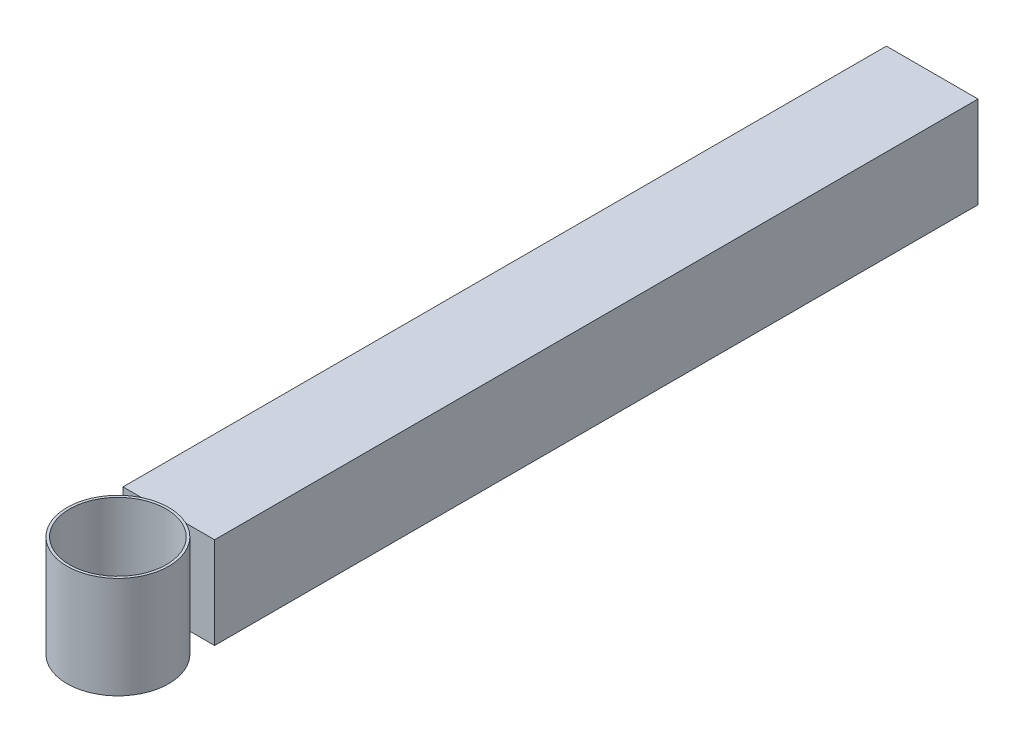
ISO-10303-21;
HEADER;
FILE_DESCRIPTION(('STEP AP214'),'2;1');
FILE_NAME('part.step','',(''),(''),'','','');
FILE_SCHEMA(('AUTOMOTIVE_DESIGN { 1 0 10303 214 1 1 1 1 }'));
ENDSEC;
DATA;
#1=APPLICATION_CONTEXT('core data for automotive mechanical design processes');
#2=APPLICATION_PROTOCOL_DEFINITION('international standard','automotive_design',2000,#1);
#3=PRODUCT_CONTEXT('',#1,'mechanical');
#4=PRODUCT('Part','Part','',(#3));
#5=PRODUCT_RELATED_PRODUCT_CATEGORY('part','',(#4));
#6=PRODUCT_DEFINITION_FORMATION('','',#4);
#7=PRODUCT_DEFINITION_CONTEXT('part definition',#1,'design');
#8=PRODUCT_DEFINITION('design','',#6,#7);
#9=PRODUCT_DEFINITION_SHAPE('','',#8);
#10=(LENGTH_UNIT() NAMED_UNIT(*) SI_UNIT(.MILLI.,.METRE.));
#11=(NAMED_UNIT(*) PLANE_ANGLE_UNIT() SI_UNIT($,.RADIAN.));
#12=(NAMED_UNIT(*) SI_UNIT($,.STERADIAN.) SOLID_ANGLE_UNIT());
#13=UNCERTAINTY_MEASURE_WITH_UNIT(LENGTH_MEASURE(1.E-05),#10,'distance_accuracy_value','');
#14=(GEOMETRIC_REPRESENTATION_CONTEXT(3) GLOBAL_UNCERTAINTY_ASSIGNED_CONTEXT((#13)) GLOBAL_UNIT_ASSIGNED_CONTEXT((#10,
#11,#12)) REPRESENTATION_CONTEXT('',''));
#15=CARTESIAN_POINT('',(0.,0.,0.));
#16=DIRECTION('',(0.,0.,1.));
#17=DIRECTION('',(1.,0.,0.));
#18=AXIS2_PLACEMENT_3D('',#15,#16,#17);
#19=CARTESIAN_POINT('',(0.,-20.,320.));
#20=DIRECTION('',(0.,1.,0.));
#21=DIRECTION('',(0.,0.,1.));
#22=AXIS2_PLACEMENT_3D('',#19,#20,#21);
#23=CYLINDRICAL_SURFACE('',#22,20.);
#24=CARTESIAN_POINT('',(0.,-20.,320.));
#25=DIRECTION('',(0.,1.,0.));
#26=DIRECTION('',(0.,0.,1.));
#27=AXIS2_PLACEMENT_3D('',#24,#25,#26);
#28=CIRCLE('',#27,20.);
#29=CARTESIAN_POINT('',(0.,-20.,340.));
#30=VERTEX_POINT('',#29);
#31=EDGE_CURVE('E11',#30,#30,#28,.T.);
#32=ORIENTED_EDGE('',*,*,#31,.T.);
#33=EDGE_LOOP('',(#32));
#34=FACE_BOUND('',#33,.T.);
#35=CARTESIAN_POINT('',(0.,20.,320.));
#36=DIRECTION('',(0.,1.,0.));
#37=DIRECTION('',(0.,0.,1.));
#38=AXIS2_PLACEMENT_3D('',#35,#36,#37);
#39=CIRCLE('',#38,20.);
#40=CARTESIAN_POINT('',(0.,20.,340.));
#41=VERTEX_POINT('',#40);
#42=EDGE_CURVE('E51',#41,#41,#39,.T.);
#43=ORIENTED_EDGE('',*,*,#42,.F.);
#44=EDGE_LOOP('',(#43));
#45=FACE_BOUND('',#44,.T.);
#46=ADVANCED_FACE('F41',(#34,#45),#23,.T.);
#47=CARTESIAN_POINT('',(0.,-20.,320.));
#48=DIRECTION('',(0.,1.,0.));
#49=DIRECTION('',(0.,0.,1.));
#50=AXIS2_PLACEMENT_3D('',#47,#48,#49);
#51=PLANE('',#50);
#52=CARTESIAN_POINT('',(0.,-20.,320.));
#53=DIRECTION('',(0.,1.,0.));
#54=DIRECTION('',(0.,0.,1.));
#55=AXIS2_PLACEMENT_3D('',#52,#53,#54);
#56=CIRCLE('',#55,19.);
#57=CARTESIAN_POINT('',(0.,-20.,339.));
#58=VERTEX_POINT('',#57);
#59=EDGE_CURVE('E47',#58,#58,#56,.T.);
#60=ORIENTED_EDGE('',*,*,#59,.T.);
#61=EDGE_LOOP('',(#60));
#62=FACE_BOUND('',#61,.T.);
#63=ORIENTED_EDGE('',*,*,#31,.F.);
#64=EDGE_LOOP('',(#63));
#65=FACE_BOUND('',#64,.T.);
#66=ADVANCED_FACE('F70',(#62,#65),#51,.F.);
#67=CARTESIAN_POINT('',(0.,-20.,320.));
#68=DIRECTION('',(0.,1.,0.));
#69=DIRECTION('',(0.,0.,1.));
#70=AXIS2_PLACEMENT_3D('',#67,#68,#69);
#71=CYLINDRICAL_SURFACE('',#70,19.);
#72=ORIENTED_EDGE('',*,*,#59,.F.);
#73=EDGE_LOOP('',(#72));
#74=FACE_BOUND('',#73,.T.);
#75=CARTESIAN_POINT('',(0.,20.,320.));
#76=DIRECTION('',(0.,1.,0.));
#77=DIRECTION('',(0.,0.,1.));
#78=AXIS2_PLACEMENT_3D('',#75,#76,#77);
#79=CIRCLE('',#78,19.);
#80=CARTESIAN_POINT('',(0.,20.,339.));
#81=VERTEX_POINT('',#80);
#82=EDGE_CURVE('E55',#81,#81,#79,.T.);
#83=ORIENTED_EDGE('',*,*,#82,.T.);
#84=EDGE_LOOP('',(#83));
#85=FACE_BOUND('',#84,.T.);
#86=ADVANCED_FACE('F61',(#74,#85),#71,.F.);
#87=CARTESIAN_POINT('',(0.,20.,320.));
#88=DIRECTION('',(0.,1.,0.));
#89=DIRECTION('',(0.,0.,1.));
#90=AXIS2_PLACEMENT_3D('',#87,#88,#89);
#91=PLANE('',#90);
#92=ORIENTED_EDGE('',*,*,#42,.T.);
#93=EDGE_LOOP('',(#92));
#94=FACE_BOUND('',#93,.T.);
#95=ORIENTED_EDGE('',*,*,#82,.F.);
#96=EDGE_LOOP('',(#95));
#97=FACE_BOUND('',#96,.T.);
#98=ADVANCED_FACE('F63',(#94,#97),#91,.T.);
#99=CLOSED_SHELL('',(#46,#66,#86,#98));
#100=MANIFOLD_SOLID_BREP('B2',#99);
#101=CARTESIAN_POINT('',(18.,-18.,300.));
#102=DIRECTION('',(-1.,0.,0.));
#103=DIRECTION('',(0.,0.,1.));
#104=AXIS2_PLACEMENT_3D('',#101,#102,#103);
#105=PLANE('',#104);
#106=DIRECTION('',(0.,1.,0.));
#107=VECTOR('',#106,1.);
#108=CARTESIAN_POINT('',(18.,-18.,0.));
#109=LINE('',#108,#107);
#110=CARTESIAN_POINT('',(18.,-18.,0.));
#111=VERTEX_POINT('',#110);
#112=CARTESIAN_POINT('',(18.,18.,0.));
#113=VERTEX_POINT('',#112);
#114=EDGE_CURVE('E166',#111,#113,#109,.T.);
#115=ORIENTED_EDGE('',*,*,#114,.T.);
#116=DIRECTION('',(0.,0.,-1.));
#117=VECTOR('',#116,1.);
#118=CARTESIAN_POINT('',(18.,18.,300.));
#119=LINE('',#118,#117);
#120=CARTESIAN_POINT('',(18.,18.,300.));
#121=VERTEX_POINT('',#120);
#122=EDGE_CURVE('E39',#121,#113,#119,.T.);
#123=ORIENTED_EDGE('',*,*,#122,.F.);
#124=DIRECTION('',(0.,1.,0.));
#125=VECTOR('',#124,1.);
#126=CARTESIAN_POINT('',(18.,-18.,300.));
#127=LINE('',#126,#125);
#128=CARTESIAN_POINT('',(18.,-18.,300.));
#129=VERTEX_POINT('',#128);
#130=EDGE_CURVE('E154',#129,#121,#127,.T.);
#131=ORIENTED_EDGE('',*,*,#130,.F.);
#132=DIRECTION('',(0.,0.,-1.));
#133=VECTOR('',#132,1.);
#134=CARTESIAN_POINT('',(18.,-18.,300.));
#135=LINE('',#134,#133);
#136=EDGE_CURVE('E162',#129,#111,#135,.T.);
#137=ORIENTED_EDGE('',*,*,#136,.T.);
#138=EDGE_LOOP('',(#115,#123,#131,#137));
#139=FACE_BOUND('',#138,.T.);
#140=ADVANCED_FACE('F103',(#139),#105,.F.);
#141=CARTESIAN_POINT('',(-18.,18.,300.));
#142=DIRECTION('',(0.,-1.,0.));
#143=DIRECTION('',(0.,0.,-1.));
#144=AXIS2_PLACEMENT_3D('',#141,#142,#143);
#145=PLANE('',#144);
#146=DIRECTION('',(-1.,0.,0.));
#147=VECTOR('',#146,1.);
#148=CARTESIAN_POINT('',(-18.,18.,0.));
#149=LINE('',#148,#147);
#150=CARTESIAN_POINT('',(-18.,18.,0.));
#151=VERTEX_POINT('',#150);
#152=EDGE_CURVE('E158',#113,#151,#149,.T.);
#153=ORIENTED_EDGE('',*,*,#152,.T.);
#154=DIRECTION('',(0.,0.,-1.));
#155=VECTOR('',#154,1.);
#156=CARTESIAN_POINT('',(-18.,18.,300.));
#157=LINE('',#156,#155);
#158=CARTESIAN_POINT('',(-18.,18.,300.));
#159=VERTEX_POINT('',#158);
#160=EDGE_CURVE('E111',#159,#151,#157,.T.);
#161=ORIENTED_EDGE('',*,*,#160,.F.);
#162=DIRECTION('',(-1.,0.,0.));
#163=VECTOR('',#162,1.);
#164=CARTESIAN_POINT('',(-18.,18.,300.));
#165=LINE('',#164,#163);
#166=EDGE_CURVE('E149',#121,#159,#165,.T.);
#167=ORIENTED_EDGE('',*,*,#166,.F.);
#168=ORIENTED_EDGE('',*,*,#122,.T.);
#169=EDGE_LOOP('',(#153,#161,#167,#168));
#170=FACE_BOUND('',#169,.T.);
#171=ADVANCED_FACE('F157',(#170),#145,.F.);
#172=CARTESIAN_POINT('',(-18.,-18.,300.));
#173=DIRECTION('',(1.,0.,0.));
#174=DIRECTION('',(0.,0.,-1.));
#175=AXIS2_PLACEMENT_3D('',#172,#173,#174);
#176=PLANE('',#175);
#177=DIRECTION('',(0.,-1.,0.));
#178=VECTOR('',#177,1.);
#179=CARTESIAN_POINT('',(-18.,-18.,0.));
#180=LINE('',#179,#178);
#181=CARTESIAN_POINT('',(-18.,-18.,0.));
#182=VERTEX_POINT('',#181);
#183=EDGE_CURVE('E136',#151,#182,#180,.T.);
#184=ORIENTED_EDGE('',*,*,#183,.T.);
#185=DIRECTION('',(0.,0.,-1.));
#186=VECTOR('',#185,1.);
#187=CARTESIAN_POINT('',(-18.,-18.,300.));
#188=LINE('',#187,#186);
#189=CARTESIAN_POINT('',(-18.,-18.,300.));
#190=VERTEX_POINT('',#189);
#191=EDGE_CURVE('E159',#190,#182,#188,.T.);
#192=ORIENTED_EDGE('',*,*,#191,.F.);
#193=DIRECTION('',(0.,-1.,0.));
#194=VECTOR('',#193,1.);
#195=CARTESIAN_POINT('',(-18.,-18.,300.));
#196=LINE('',#195,#194);
#197=EDGE_CURVE('E152',#159,#190,#196,.T.);
#198=ORIENTED_EDGE('',*,*,#197,.F.);
#199=ORIENTED_EDGE('',*,*,#160,.T.);
#200=EDGE_LOOP('',(#184,#192,#198,#199));
#201=FACE_BOUND('',#200,.T.);
#202=ADVANCED_FACE('F160',(#201),#176,.F.);
#203=CARTESIAN_POINT('',(-18.,-18.,300.));
#204=DIRECTION('',(0.,1.,0.));
#205=DIRECTION('',(0.,0.,1.));
#206=AXIS2_PLACEMENT_3D('',#203,#204,#205);
#207=PLANE('',#206);
#208=DIRECTION('',(1.,0.,0.));
#209=VECTOR('',#208,1.);
#210=CARTESIAN_POINT('',(-18.,-18.,0.));
#211=LINE('',#210,#209);
#212=EDGE_CURVE('E142',#182,#111,#211,.T.);
#213=ORIENTED_EDGE('',*,*,#212,.T.);
#214=ORIENTED_EDGE('',*,*,#136,.F.);
#215=DIRECTION('',(1.,0.,0.));
#216=VECTOR('',#215,1.);
#217=CARTESIAN_POINT('',(-18.,-18.,300.));
#218=LINE('',#217,#216);
#219=EDGE_CURVE('E119',#190,#129,#218,.T.);
#220=ORIENTED_EDGE('',*,*,#219,.F.);
#221=ORIENTED_EDGE('',*,*,#191,.T.);
#222=EDGE_LOOP('',(#213,#214,#220,#221));
#223=FACE_BOUND('',#222,.T.);
#224=ADVANCED_FACE('F173',(#223),#207,.F.);
#225=CARTESIAN_POINT('',(0.,0.,300.));
#226=DIRECTION('',(0.,0.,-1.));
#227=DIRECTION('',(-1.,0.,0.));
#228=AXIS2_PLACEMENT_3D('',#225,#226,#227);
#229=PLANE('',#228);
#230=ORIENTED_EDGE('',*,*,#219,.T.);
#231=ORIENTED_EDGE('',*,*,#130,.T.);
#232=ORIENTED_EDGE('',*,*,#166,.T.);
#233=ORIENTED_EDGE('',*,*,#197,.T.);
#234=EDGE_LOOP('',(#230,#231,#232,#233));
#235=FACE_BOUND('',#234,.T.);
#236=ADVANCED_FACE('F150',(#235),#229,.F.);
#237=CARTESIAN_POINT('',(0.,0.,0.));
#238=DIRECTION('',(0.,0.,-1.));
#239=DIRECTION('',(-1.,0.,0.));
#240=AXIS2_PLACEMENT_3D('',#237,#238,#239);
#241=PLANE('',#240);
#242=ORIENTED_EDGE('',*,*,#114,.F.);
#243=ORIENTED_EDGE('',*,*,#212,.F.);
#244=ORIENTED_EDGE('',*,*,#183,.F.);
#245=ORIENTED_EDGE('',*,*,#152,.F.);
#246=EDGE_LOOP('',(#242,#243,#244,#245));
#247=FACE_BOUND('',#246,.T.);
#248=ADVANCED_FACE('F176',(#247),#241,.T.);
#249=CLOSED_SHELL('',(#140,#171,#202,#224,#236,#248));
#250=MANIFOLD_SOLID_BREP('B6',#249);
#251=ADVANCED_BREP_SHAPE_REPRESENTATION('',(#18,#100,#250),#14);
#252=SHAPE_DEFINITION_REPRESENTATION(#9,#251);
ENDSEC;
END-ISO-10303-21;
